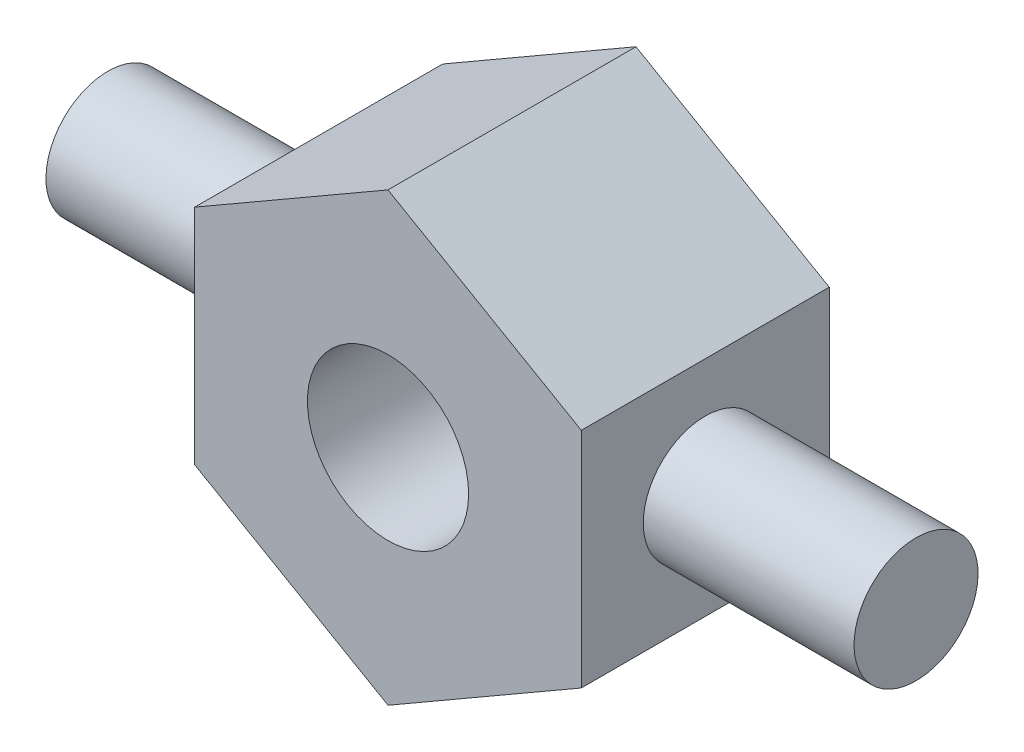
ISO-10303-21;
HEADER;
FILE_DESCRIPTION(('STEP AP214'),'2;1');
FILE_NAME('part.step','',(''),(''),'','','');
FILE_SCHEMA(('AUTOMOTIVE_DESIGN { 1 0 10303 214 1 1 1 1 }'));
ENDSEC;
DATA;
#1=APPLICATION_CONTEXT('core data for automotive mechanical design processes');
#2=APPLICATION_PROTOCOL_DEFINITION('international standard','automotive_design',2000,#1);
#3=PRODUCT_CONTEXT('',#1,'mechanical');
#4=PRODUCT('Part','Part','',(#3));
#5=PRODUCT_RELATED_PRODUCT_CATEGORY('part','',(#4));
#6=PRODUCT_DEFINITION_FORMATION('','',#4);
#7=PRODUCT_DEFINITION_CONTEXT('part definition',#1,'design');
#8=PRODUCT_DEFINITION('design','',#6,#7);
#9=PRODUCT_DEFINITION_SHAPE('','',#8);
#10=(LENGTH_UNIT() NAMED_UNIT(*) SI_UNIT(.MILLI.,.METRE.));
#11=(NAMED_UNIT(*) PLANE_ANGLE_UNIT() SI_UNIT($,.RADIAN.));
#12=(NAMED_UNIT(*) SI_UNIT($,.STERADIAN.) SOLID_ANGLE_UNIT());
#13=UNCERTAINTY_MEASURE_WITH_UNIT(LENGTH_MEASURE(1.E-05),#10,'distance_accuracy_value','');
#14=(GEOMETRIC_REPRESENTATION_CONTEXT(3) GLOBAL_UNCERTAINTY_ASSIGNED_CONTEXT((#13)) GLOBAL_UNIT_ASSIGNED_CONTEXT((#10,
#11,#12)) REPRESENTATION_CONTEXT('',''));
#15=CARTESIAN_POINT('',(0.,0.,0.));
#16=DIRECTION('',(0.,0.,1.));
#17=DIRECTION('',(1.,0.,0.));
#18=AXIS2_PLACEMENT_3D('',#15,#16,#17);
#19=CARTESIAN_POINT('',(0.,0.,100.));
#20=DIRECTION('',(0.,0.,1.));
#21=DIRECTION('',(1.,0.,0.));
#22=AXIS2_PLACEMENT_3D('',#19,#20,#21);
#23=PLANE('',#22);
#24=DIRECTION('',(0.866025403784439,-0.5,0.));
#25=VECTOR('',#24,1.);
#26=CARTESIAN_POINT('',(-77.9422863405995,-45.,100.));
#27=LINE('',#26,#25);
#28=CARTESIAN_POINT('',(-77.9422863405995,-45.,100.));
#29=VERTEX_POINT('',#28);
#30=CARTESIAN_POINT('',(0.,-90.,100.));
#31=VERTEX_POINT('',#30);
#32=EDGE_CURVE('E159',#29,#31,#27,.T.);
#33=ORIENTED_EDGE('',*,*,#32,.T.);
#34=DIRECTION('',(0.866025403784439,0.5,0.));
#35=VECTOR('',#34,1.);
#36=CARTESIAN_POINT('',(0.,-90.,100.));
#37=LINE('',#36,#35);
#38=CARTESIAN_POINT('',(77.9422863405995,-45.,100.));
#39=VERTEX_POINT('',#38);
#40=EDGE_CURVE('E107',#31,#39,#37,.T.);
#41=ORIENTED_EDGE('',*,*,#40,.T.);
#42=DIRECTION('',(0.,1.,0.));
#43=VECTOR('',#42,1.);
#44=CARTESIAN_POINT('',(77.9422863405995,-45.,100.));
#45=LINE('',#44,#43);
#46=CARTESIAN_POINT('',(77.9422863405995,45.,100.));
#47=VERTEX_POINT('',#46);
#48=EDGE_CURVE('E120',#39,#47,#45,.T.);
#49=ORIENTED_EDGE('',*,*,#48,.T.);
#50=DIRECTION('',(-0.866025403784439,0.5,0.));
#51=VECTOR('',#50,1.);
#52=CARTESIAN_POINT('',(77.9422863405995,45.,100.));
#53=LINE('',#52,#51);
#54=CARTESIAN_POINT('',(0.,90.,100.));
#55=VERTEX_POINT('',#54);
#56=EDGE_CURVE('E114',#47,#55,#53,.T.);
#57=ORIENTED_EDGE('',*,*,#56,.T.);
#58=DIRECTION('',(-0.866025403784438,-0.5,0.));
#59=VECTOR('',#58,1.);
#60=CARTESIAN_POINT('',(0.,90.,100.));
#61=LINE('',#60,#59);
#62=CARTESIAN_POINT('',(-77.9422863405995,45.,100.));
#63=VERTEX_POINT('',#62);
#64=EDGE_CURVE('E118',#55,#63,#61,.T.);
#65=ORIENTED_EDGE('',*,*,#64,.T.);
#66=DIRECTION('',(0.,-1.,0.));
#67=VECTOR('',#66,1.);
#68=CARTESIAN_POINT('',(-77.9422863405995,45.,100.));
#69=LINE('',#68,#67);
#70=EDGE_CURVE('E69',#63,#29,#69,.T.);
#71=ORIENTED_EDGE('',*,*,#70,.T.);
#72=EDGE_LOOP('',(#33,#41,#49,#57,#65,#71));
#73=FACE_BOUND('',#72,.T.);
#74=CARTESIAN_POINT('',(0.,0.,100.));
#75=DIRECTION('',(0.,0.,1.));
#76=DIRECTION('',(1.,0.,0.));
#77=AXIS2_PLACEMENT_3D('',#74,#75,#76);
#78=CIRCLE('',#77,32.5);
#79=CARTESIAN_POINT('',(32.5,0.,100.));
#80=VERTEX_POINT('',#79);
#81=EDGE_CURVE('E147',#80,#80,#78,.T.);
#82=ORIENTED_EDGE('',*,*,#81,.F.);
#83=EDGE_LOOP('',(#82));
#84=FACE_BOUND('',#83,.T.);
#85=ADVANCED_FACE('F49',(#73,#84),#23,.T.);
#86=CARTESIAN_POINT('',(0.,0.,0.));
#87=DIRECTION('',(0.,0.,1.));
#88=DIRECTION('',(1.,0.,0.));
#89=AXIS2_PLACEMENT_3D('',#86,#87,#88);
#90=PLANE('',#89);
#91=DIRECTION('',(0.866025403784439,-0.5,0.));
#92=VECTOR('',#91,1.);
#93=CARTESIAN_POINT('',(-77.9422863405995,-45.,0.));
#94=LINE('',#93,#92);
#95=CARTESIAN_POINT('',(-77.9422863405995,-45.,0.));
#96=VERTEX_POINT('',#95);
#97=CARTESIAN_POINT('',(0.,-90.,0.));
#98=VERTEX_POINT('',#97);
#99=EDGE_CURVE('E142',#96,#98,#94,.T.);
#100=ORIENTED_EDGE('',*,*,#99,.F.);
#101=DIRECTION('',(0.,-1.,0.));
#102=VECTOR('',#101,1.);
#103=CARTESIAN_POINT('',(-77.9422863405995,45.,0.));
#104=LINE('',#103,#102);
#105=CARTESIAN_POINT('',(-77.9422863405995,45.,0.));
#106=VERTEX_POINT('',#105);
#107=EDGE_CURVE('E98',#106,#96,#104,.T.);
#108=ORIENTED_EDGE('',*,*,#107,.F.);
#109=DIRECTION('',(-0.866025403784438,-0.5,0.));
#110=VECTOR('',#109,1.);
#111=CARTESIAN_POINT('',(0.,90.,0.));
#112=LINE('',#111,#110);
#113=CARTESIAN_POINT('',(0.,90.,0.));
#114=VERTEX_POINT('',#113);
#115=EDGE_CURVE('E92',#114,#106,#112,.T.);
#116=ORIENTED_EDGE('',*,*,#115,.F.);
#117=DIRECTION('',(-0.866025403784439,0.5,0.));
#118=VECTOR('',#117,1.);
#119=CARTESIAN_POINT('',(77.9422863405995,45.,0.));
#120=LINE('',#119,#118);
#121=CARTESIAN_POINT('',(77.9422863405995,45.,0.));
#122=VERTEX_POINT('',#121);
#123=EDGE_CURVE('E129',#122,#114,#120,.T.);
#124=ORIENTED_EDGE('',*,*,#123,.F.);
#125=DIRECTION('',(0.,1.,0.));
#126=VECTOR('',#125,1.);
#127=CARTESIAN_POINT('',(77.9422863405995,-45.,0.));
#128=LINE('',#127,#126);
#129=CARTESIAN_POINT('',(77.9422863405995,-45.,0.));
#130=VERTEX_POINT('',#129);
#131=EDGE_CURVE('E150',#130,#122,#128,.T.);
#132=ORIENTED_EDGE('',*,*,#131,.F.);
#133=DIRECTION('',(0.866025403784439,0.5,0.));
#134=VECTOR('',#133,1.);
#135=CARTESIAN_POINT('',(0.,-90.,0.));
#136=LINE('',#135,#134);
#137=EDGE_CURVE('E146',#98,#130,#136,.T.);
#138=ORIENTED_EDGE('',*,*,#137,.F.);
#139=EDGE_LOOP('',(#100,#108,#116,#124,#132,#138));
#140=FACE_BOUND('',#139,.T.);
#141=CARTESIAN_POINT('',(0.,0.,0.));
#142=DIRECTION('',(0.,0.,1.));
#143=DIRECTION('',(1.,0.,0.));
#144=AXIS2_PLACEMENT_3D('',#141,#142,#143);
#145=CIRCLE('',#144,32.5);
#146=CARTESIAN_POINT('',(32.5,0.,0.));
#147=VERTEX_POINT('',#146);
#148=EDGE_CURVE('E183',#147,#147,#145,.T.);
#149=ORIENTED_EDGE('',*,*,#148,.T.);
#150=EDGE_LOOP('',(#149));
#151=FACE_BOUND('',#150,.T.);
#152=ADVANCED_FACE('F222',(#140,#151),#90,.F.);
#153=CARTESIAN_POINT('',(-77.9422863405995,-45.,100.));
#154=DIRECTION('',(0.5,0.866025403784439,0.));
#155=DIRECTION('',(-0.866025403784439,0.5,0.));
#156=AXIS2_PLACEMENT_3D('',#153,#154,#155);
#157=PLANE('',#156);
#158=ORIENTED_EDGE('',*,*,#99,.T.);
#159=DIRECTION('',(0.,0.,-1.));
#160=VECTOR('',#159,1.);
#161=CARTESIAN_POINT('',(0.,-90.,100.));
#162=LINE('',#161,#160);
#163=EDGE_CURVE('E53',#31,#98,#162,.T.);
#164=ORIENTED_EDGE('',*,*,#163,.F.);
#165=ORIENTED_EDGE('',*,*,#32,.F.);
#166=DIRECTION('',(0.,0.,-1.));
#167=VECTOR('',#166,1.);
#168=CARTESIAN_POINT('',(-77.9422863405995,-45.,100.));
#169=LINE('',#168,#167);
#170=EDGE_CURVE('E138',#29,#96,#169,.T.);
#171=ORIENTED_EDGE('',*,*,#170,.T.);
#172=EDGE_LOOP('',(#158,#164,#165,#171));
#173=FACE_BOUND('',#172,.T.);
#174=ADVANCED_FACE('F51',(#173),#157,.F.);
#175=CARTESIAN_POINT('',(0.,-90.,100.));
#176=DIRECTION('',(-0.5,0.866025403784439,0.));
#177=DIRECTION('',(-0.866025403784439,-0.5,0.));
#178=AXIS2_PLACEMENT_3D('',#175,#176,#177);
#179=PLANE('',#178);
#180=ORIENTED_EDGE('',*,*,#137,.T.);
#181=DIRECTION('',(0.,0.,-1.));
#182=VECTOR('',#181,1.);
#183=CARTESIAN_POINT('',(77.9422863405995,-45.,100.));
#184=LINE('',#183,#182);
#185=EDGE_CURVE('E165',#39,#130,#184,.T.);
#186=ORIENTED_EDGE('',*,*,#185,.F.);
#187=ORIENTED_EDGE('',*,*,#40,.F.);
#188=ORIENTED_EDGE('',*,*,#163,.T.);
#189=EDGE_LOOP('',(#180,#186,#187,#188));
#190=FACE_BOUND('',#189,.T.);
#191=ADVANCED_FACE('F272',(#190),#179,.F.);
#192=CARTESIAN_POINT('',(77.9422863405995,-45.,100.));
#193=DIRECTION('',(-1.,0.,0.));
#194=DIRECTION('',(0.,-1.,0.));
#195=AXIS2_PLACEMENT_3D('',#192,#193,#194);
#196=PLANE('',#195);
#197=CARTESIAN_POINT('',(77.9422863405995,0.,50.));
#198=DIRECTION('',(1.,0.,0.));
#199=DIRECTION('',(0.,1.,0.));
#200=AXIS2_PLACEMENT_3D('',#197,#198,#199);
#201=CIRCLE('',#200,25.);
#202=CARTESIAN_POINT('',(77.9422863405995,25.,50.));
#203=VERTEX_POINT('',#202);
#204=EDGE_CURVE('E60',#203,#203,#201,.T.);
#205=ORIENTED_EDGE('',*,*,#204,.F.);
#206=EDGE_LOOP('',(#205));
#207=FACE_BOUND('',#206,.T.);
#208=ORIENTED_EDGE('',*,*,#131,.T.);
#209=DIRECTION('',(0.,0.,-1.));
#210=VECTOR('',#209,1.);
#211=CARTESIAN_POINT('',(77.9422863405995,45.,100.));
#212=LINE('',#211,#210);
#213=EDGE_CURVE('E131',#47,#122,#212,.T.);
#214=ORIENTED_EDGE('',*,*,#213,.F.);
#215=ORIENTED_EDGE('',*,*,#48,.F.);
#216=ORIENTED_EDGE('',*,*,#185,.T.);
#217=EDGE_LOOP('',(#208,#214,#215,#216));
#218=FACE_BOUND('',#217,.T.);
#219=ADVANCED_FACE('F267',(#207,#218),#196,.F.);
#220=CARTESIAN_POINT('',(77.9422863405995,45.,100.));
#221=DIRECTION('',(-0.5,-0.866025403784439,0.));
#222=DIRECTION('',(0.866025403784439,-0.5,0.));
#223=AXIS2_PLACEMENT_3D('',#220,#221,#222);
#224=PLANE('',#223);
#225=ORIENTED_EDGE('',*,*,#123,.T.);
#226=DIRECTION('',(0.,0.,-1.));
#227=VECTOR('',#226,1.);
#228=CARTESIAN_POINT('',(0.,90.,100.));
#229=LINE('',#228,#227);
#230=EDGE_CURVE('E126',#55,#114,#229,.T.);
#231=ORIENTED_EDGE('',*,*,#230,.F.);
#232=ORIENTED_EDGE('',*,*,#56,.F.);
#233=ORIENTED_EDGE('',*,*,#213,.T.);
#234=EDGE_LOOP('',(#225,#231,#232,#233));
#235=FACE_BOUND('',#234,.T.);
#236=ADVANCED_FACE('F127',(#235),#224,.F.);
#237=CARTESIAN_POINT('',(0.,90.,100.));
#238=DIRECTION('',(0.5,-0.866025403784438,0.));
#239=DIRECTION('',(0.866025403784439,0.5,0.));
#240=AXIS2_PLACEMENT_3D('',#237,#238,#239);
#241=PLANE('',#240);
#242=ORIENTED_EDGE('',*,*,#115,.T.);
#243=DIRECTION('',(0.,0.,-1.));
#244=VECTOR('',#243,1.);
#245=CARTESIAN_POINT('',(-77.9422863405995,45.,100.));
#246=LINE('',#245,#244);
#247=EDGE_CURVE('E132',#63,#106,#246,.T.);
#248=ORIENTED_EDGE('',*,*,#247,.F.);
#249=ORIENTED_EDGE('',*,*,#64,.F.);
#250=ORIENTED_EDGE('',*,*,#230,.T.);
#251=EDGE_LOOP('',(#242,#248,#249,#250));
#252=FACE_BOUND('',#251,.T.);
#253=ADVANCED_FACE('F134',(#252),#241,.F.);
#254=CARTESIAN_POINT('',(-77.9422863405995,45.,100.));
#255=DIRECTION('',(1.,0.,0.));
#256=DIRECTION('',(0.,1.,0.));
#257=AXIS2_PLACEMENT_3D('',#254,#255,#256);
#258=PLANE('',#257);
#259=CARTESIAN_POINT('',(-77.9422863405995,0.,50.));
#260=DIRECTION('',(-1.,0.,0.));
#261=DIRECTION('',(0.,-1.,0.));
#262=AXIS2_PLACEMENT_3D('',#259,#260,#261);
#263=CIRCLE('',#262,25.);
#264=CARTESIAN_POINT('',(-77.9422863405995,-25.,50.));
#265=VERTEX_POINT('',#264);
#266=EDGE_CURVE('E11',#265,#265,#263,.T.);
#267=ORIENTED_EDGE('',*,*,#266,.F.);
#268=EDGE_LOOP('',(#267));
#269=FACE_BOUND('',#268,.T.);
#270=ORIENTED_EDGE('',*,*,#107,.T.);
#271=ORIENTED_EDGE('',*,*,#170,.F.);
#272=ORIENTED_EDGE('',*,*,#70,.F.);
#273=ORIENTED_EDGE('',*,*,#247,.T.);
#274=EDGE_LOOP('',(#270,#271,#272,#273));
#275=FACE_BOUND('',#274,.T.);
#276=ADVANCED_FACE('F208',(#269,#275),#258,.F.);
#277=CARTESIAN_POINT('',(0.,0.,100.));
#278=DIRECTION('',(0.,0.,-1.));
#279=DIRECTION('',(-1.,0.,0.));
#280=AXIS2_PLACEMENT_3D('',#277,#278,#279);
#281=CYLINDRICAL_SURFACE('',#280,32.5);
#282=ORIENTED_EDGE('',*,*,#81,.T.);
#283=EDGE_LOOP('',(#282));
#284=FACE_BOUND('',#283,.T.);
#285=ORIENTED_EDGE('',*,*,#148,.F.);
#286=EDGE_LOOP('',(#285));
#287=FACE_BOUND('',#286,.T.);
#288=ADVANCED_FACE('F210',(#284,#287),#281,.F.);
#289=CARTESIAN_POINT('',(162.942286340599,0.,50.));
#290=DIRECTION('',(-1.,0.,0.));
#291=DIRECTION('',(0.,-1.,0.));
#292=AXIS2_PLACEMENT_3D('',#289,#290,#291);
#293=CYLINDRICAL_SURFACE('',#292,25.);
#294=CARTESIAN_POINT('',(162.942286340599,0.,50.));
#295=DIRECTION('',(1.,0.,0.));
#296=DIRECTION('',(0.,1.,0.));
#297=AXIS2_PLACEMENT_3D('',#294,#295,#296);
#298=CIRCLE('',#297,25.);
#299=CARTESIAN_POINT('',(162.942286340599,25.,50.));
#300=VERTEX_POINT('',#299);
#301=EDGE_CURVE('E179',#300,#300,#298,.T.);
#302=ORIENTED_EDGE('',*,*,#301,.F.);
#303=EDGE_LOOP('',(#302));
#304=FACE_BOUND('',#303,.T.);
#305=ORIENTED_EDGE('',*,*,#204,.T.);
#306=EDGE_LOOP('',(#305));
#307=FACE_BOUND('',#306,.T.);
#308=ADVANCED_FACE('F216',(#304,#307),#293,.T.);
#309=CARTESIAN_POINT('',(162.942286340599,0.,50.));
#310=DIRECTION('',(1.,0.,0.));
#311=DIRECTION('',(0.,1.,0.));
#312=AXIS2_PLACEMENT_3D('',#309,#310,#311);
#313=PLANE('',#312);
#314=ORIENTED_EDGE('',*,*,#301,.T.);
#315=EDGE_LOOP('',(#314));
#316=FACE_BOUND('',#315,.T.);
#317=ADVANCED_FACE('F204',(#316),#313,.T.);
#318=CARTESIAN_POINT('',(-162.942286340599,0.,50.));
#319=DIRECTION('',(1.,0.,0.));
#320=DIRECTION('',(0.,1.,0.));
#321=AXIS2_PLACEMENT_3D('',#318,#319,#320);
#322=CYLINDRICAL_SURFACE('',#321,25.);
#323=CARTESIAN_POINT('',(-162.942286340599,0.,50.));
#324=DIRECTION('',(-1.,0.,0.));
#325=DIRECTION('',(0.,-1.,0.));
#326=AXIS2_PLACEMENT_3D('',#323,#324,#325);
#327=CIRCLE('',#326,25.);
#328=CARTESIAN_POINT('',(-162.942286340599,-25.,50.));
#329=VERTEX_POINT('',#328);
#330=EDGE_CURVE('E194',#329,#329,#327,.T.);
#331=ORIENTED_EDGE('',*,*,#330,.F.);
#332=EDGE_LOOP('',(#331));
#333=FACE_BOUND('',#332,.T.);
#334=ORIENTED_EDGE('',*,*,#266,.T.);
#335=EDGE_LOOP('',(#334));
#336=FACE_BOUND('',#335,.T.);
#337=ADVANCED_FACE('F201',(#333,#336),#322,.T.);
#338=CARTESIAN_POINT('',(-162.942286340599,0.,50.));
#339=DIRECTION('',(-1.,0.,0.));
#340=DIRECTION('',(0.,-1.,0.));
#341=AXIS2_PLACEMENT_3D('',#338,#339,#340);
#342=PLANE('',#341);
#343=ORIENTED_EDGE('',*,*,#330,.T.);
#344=EDGE_LOOP('',(#343));
#345=FACE_BOUND('',#344,.T.);
#346=ADVANCED_FACE('F199',(#345),#342,.T.);
#347=CLOSED_SHELL('',(#85,#152,#174,#191,#219,#236,#253,#276,#288,#308,#317,#337,#346));
#348=MANIFOLD_SOLID_BREP('B2',#347);
#349=ADVANCED_BREP_SHAPE_REPRESENTATION('',(#18,#348),#14);
#350=SHAPE_DEFINITION_REPRESENTATION(#9,#349);
ENDSEC;
END-ISO-10303-21;
